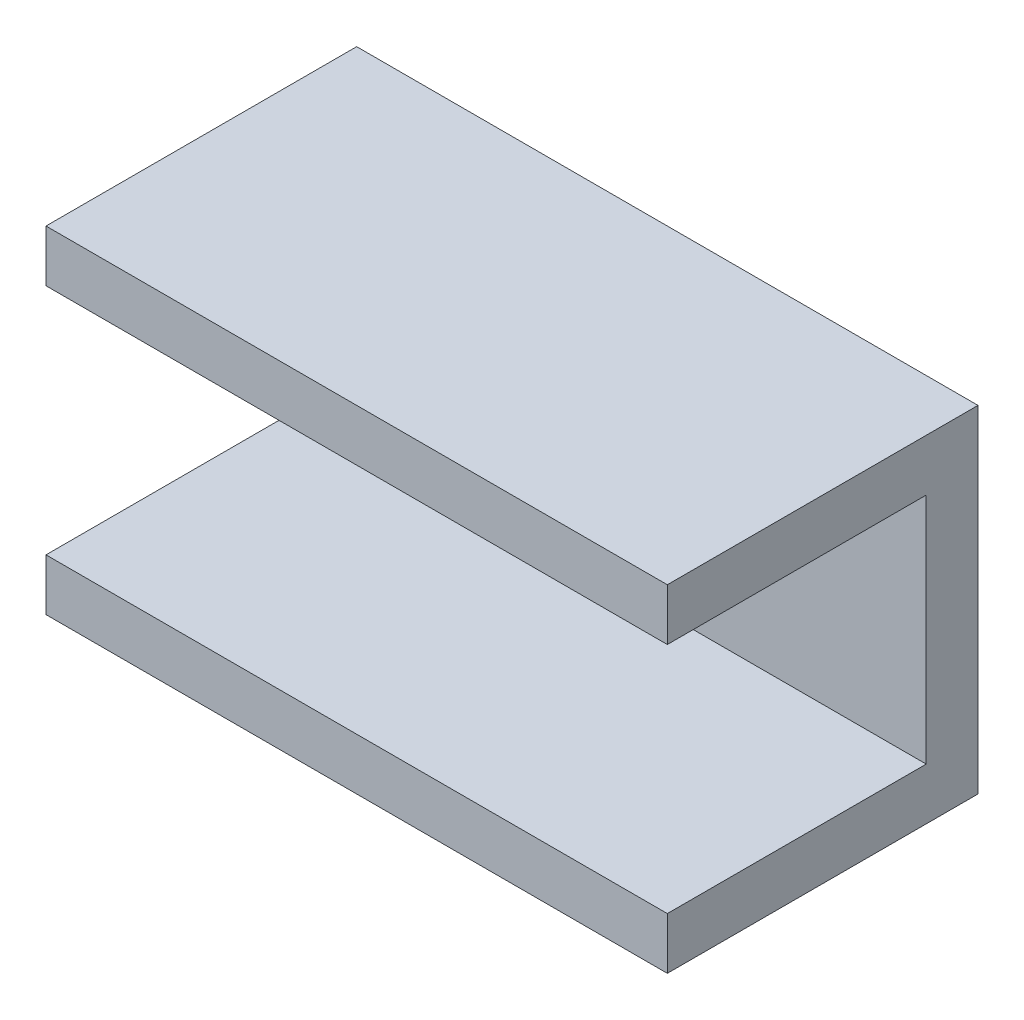
ISO-10303-21;
HEADER;
FILE_DESCRIPTION(('STEP AP214'),'2;1');
FILE_NAME('part.step','',(''),(''),'','','');
FILE_SCHEMA(('AUTOMOTIVE_DESIGN { 1 0 10303 214 1 1 1 1 }'));
ENDSEC;
DATA;
#1=APPLICATION_CONTEXT('core data for automotive mechanical design processes');
#2=APPLICATION_PROTOCOL_DEFINITION('international standard','automotive_design',2000,#1);
#3=PRODUCT_CONTEXT('',#1,'mechanical');
#4=PRODUCT('Part','Part','',(#3));
#5=PRODUCT_RELATED_PRODUCT_CATEGORY('part','',(#4));
#6=PRODUCT_DEFINITION_FORMATION('','',#4);
#7=PRODUCT_DEFINITION_CONTEXT('part definition',#1,'design');
#8=PRODUCT_DEFINITION('design','',#6,#7);
#9=PRODUCT_DEFINITION_SHAPE('','',#8);
#10=(LENGTH_UNIT() NAMED_UNIT(*) SI_UNIT(.MILLI.,.METRE.));
#11=(NAMED_UNIT(*) PLANE_ANGLE_UNIT() SI_UNIT($,.RADIAN.));
#12=(NAMED_UNIT(*) SI_UNIT($,.STERADIAN.) SOLID_ANGLE_UNIT());
#13=UNCERTAINTY_MEASURE_WITH_UNIT(LENGTH_MEASURE(1.E-05),#10,'distance_accuracy_value','');
#14=(GEOMETRIC_REPRESENTATION_CONTEXT(3) GLOBAL_UNCERTAINTY_ASSIGNED_CONTEXT((#13)) GLOBAL_UNIT_ASSIGNED_CONTEXT((#10,
#11,#12)) REPRESENTATION_CONTEXT('',''));
#15=CARTESIAN_POINT('',(0.,0.,0.));
#16=DIRECTION('',(0.,0.,1.));
#17=DIRECTION('',(1.,0.,0.));
#18=AXIS2_PLACEMENT_3D('',#15,#16,#17);
#19=CARTESIAN_POINT('',(76.2,0.,6.35));
#20=DIRECTION('',(0.,0.,-1.));
#21=DIRECTION('',(-1.,0.,0.));
#22=AXIS2_PLACEMENT_3D('',#19,#20,#21);
#23=PLANE('',#22);
#24=DIRECTION('',(0.,-1.,0.));
#25=VECTOR('',#24,1.);
#26=CARTESIAN_POINT('',(0.,0.,6.35));
#27=LINE('',#26,#25);
#28=CARTESIAN_POINT('',(0.,14.2875,6.35));
#29=VERTEX_POINT('',#28);
#30=CARTESIAN_POINT('',(0.,-14.2875,6.35));
#31=VERTEX_POINT('',#30);
#32=EDGE_CURVE('E133',#29,#31,#27,.T.);
#33=ORIENTED_EDGE('',*,*,#32,.T.);
#34=DIRECTION('',(-1.,0.,0.));
#35=VECTOR('',#34,1.);
#36=CARTESIAN_POINT('',(76.2,-14.2875,6.35));
#37=LINE('',#36,#35);
#38=CARTESIAN_POINT('',(76.2,-14.2875,6.35));
#39=VERTEX_POINT('',#38);
#40=EDGE_CURVE('E11',#39,#31,#37,.T.);
#41=ORIENTED_EDGE('',*,*,#40,.F.);
#42=DIRECTION('',(0.,-1.,0.));
#43=VECTOR('',#42,1.);
#44=CARTESIAN_POINT('',(76.2,0.,6.35));
#45=LINE('',#44,#43);
#46=CARTESIAN_POINT('',(76.2,14.2875,6.35));
#47=VERTEX_POINT('',#46);
#48=EDGE_CURVE('E94',#47,#39,#45,.T.);
#49=ORIENTED_EDGE('',*,*,#48,.F.);
#50=DIRECTION('',(-1.,0.,0.));
#51=VECTOR('',#50,1.);
#52=CARTESIAN_POINT('',(76.2,14.2875,6.35));
#53=LINE('',#52,#51);
#54=EDGE_CURVE('E129',#47,#29,#53,.T.);
#55=ORIENTED_EDGE('',*,*,#54,.T.);
#56=EDGE_LOOP('',(#33,#41,#49,#55));
#57=FACE_BOUND('',#56,.T.);
#58=ADVANCED_FACE('F38',(#57),#23,.F.);
#59=CARTESIAN_POINT('',(76.2,-14.2875,0.));
#60=DIRECTION('',(0.,1.,0.));
#61=DIRECTION('',(0.,0.,1.));
#62=AXIS2_PLACEMENT_3D('',#59,#60,#61);
#63=PLANE('',#62);
#64=DIRECTION('',(0.,0.,-1.));
#65=VECTOR('',#64,1.);
#66=CARTESIAN_POINT('',(0.,-14.2875,0.));
#67=LINE('',#66,#65);
#68=CARTESIAN_POINT('',(0.,-14.2875,38.1));
#69=VERTEX_POINT('',#68);
#70=EDGE_CURVE('E136',#69,#31,#67,.T.);
#71=ORIENTED_EDGE('',*,*,#70,.F.);
#72=DIRECTION('',(-1.,0.,0.));
#73=VECTOR('',#72,1.);
#74=CARTESIAN_POINT('',(76.2,-14.2875,38.1));
#75=LINE('',#74,#73);
#76=CARTESIAN_POINT('',(76.2,-14.2875,38.1));
#77=VERTEX_POINT('',#76);
#78=EDGE_CURVE('E46',#77,#69,#75,.T.);
#79=ORIENTED_EDGE('',*,*,#78,.F.);
#80=DIRECTION('',(0.,0.,-1.));
#81=VECTOR('',#80,1.);
#82=CARTESIAN_POINT('',(76.2,-14.2875,0.));
#83=LINE('',#82,#81);
#84=EDGE_CURVE('E176',#77,#39,#83,.T.);
#85=ORIENTED_EDGE('',*,*,#84,.T.);
#86=ORIENTED_EDGE('',*,*,#40,.T.);
#87=EDGE_LOOP('',(#71,#79,#85,#86));
#88=FACE_BOUND('',#87,.T.);
#89=ADVANCED_FACE('F166',(#88),#63,.T.);
#90=CARTESIAN_POINT('',(76.2,0.,38.1));
#91=DIRECTION('',(0.,0.,1.));
#92=DIRECTION('',(0.,-1.,0.));
#93=AXIS2_PLACEMENT_3D('',#90,#91,#92);
#94=PLANE('',#93);
#95=DIRECTION('',(0.,1.,0.));
#96=VECTOR('',#95,1.);
#97=CARTESIAN_POINT('',(0.,0.,38.1));
#98=LINE('',#97,#96);
#99=CARTESIAN_POINT('',(0.,-20.6375,38.1));
#100=VERTEX_POINT('',#99);
#101=EDGE_CURVE('E139',#100,#69,#98,.T.);
#102=ORIENTED_EDGE('',*,*,#101,.F.);
#103=DIRECTION('',(-1.,0.,0.));
#104=VECTOR('',#103,1.);
#105=CARTESIAN_POINT('',(76.2,-20.6375,38.1));
#106=LINE('',#105,#104);
#107=CARTESIAN_POINT('',(76.2,-20.6375,38.1));
#108=VERTEX_POINT('',#107);
#109=EDGE_CURVE('E156',#108,#100,#106,.T.);
#110=ORIENTED_EDGE('',*,*,#109,.F.);
#111=DIRECTION('',(0.,1.,0.));
#112=VECTOR('',#111,1.);
#113=CARTESIAN_POINT('',(76.2,0.,38.1));
#114=LINE('',#113,#112);
#115=EDGE_CURVE('E163',#108,#77,#114,.T.);
#116=ORIENTED_EDGE('',*,*,#115,.T.);
#117=ORIENTED_EDGE('',*,*,#78,.T.);
#118=EDGE_LOOP('',(#102,#110,#116,#117));
#119=FACE_BOUND('',#118,.T.);
#120=ADVANCED_FACE('F161',(#119),#94,.T.);
#121=CARTESIAN_POINT('',(76.2,-20.6375,0.));
#122=DIRECTION('',(0.,-1.,0.));
#123=DIRECTION('',(0.,0.,-1.));
#124=AXIS2_PLACEMENT_3D('',#121,#122,#123);
#125=PLANE('',#124);
#126=DIRECTION('',(0.,0.,1.));
#127=VECTOR('',#126,1.);
#128=CARTESIAN_POINT('',(0.,-20.6375,0.));
#129=LINE('',#128,#127);
#130=CARTESIAN_POINT('',(0.,-20.6375,0.));
#131=VERTEX_POINT('',#130);
#132=EDGE_CURVE('E142',#131,#100,#129,.T.);
#133=ORIENTED_EDGE('',*,*,#132,.F.);
#134=DIRECTION('',(-1.,0.,0.));
#135=VECTOR('',#134,1.);
#136=CARTESIAN_POINT('',(76.2,-20.6375,0.));
#137=LINE('',#136,#135);
#138=CARTESIAN_POINT('',(76.2,-20.6375,0.));
#139=VERTEX_POINT('',#138);
#140=EDGE_CURVE('E154',#139,#131,#137,.T.);
#141=ORIENTED_EDGE('',*,*,#140,.F.);
#142=DIRECTION('',(0.,0.,1.));
#143=VECTOR('',#142,1.);
#144=CARTESIAN_POINT('',(76.2,-20.6375,0.));
#145=LINE('',#144,#143);
#146=EDGE_CURVE('E175',#139,#108,#145,.T.);
#147=ORIENTED_EDGE('',*,*,#146,.T.);
#148=ORIENTED_EDGE('',*,*,#109,.T.);
#149=EDGE_LOOP('',(#133,#141,#147,#148));
#150=FACE_BOUND('',#149,.T.);
#151=ADVANCED_FACE('F173',(#150),#125,.T.);
#152=CARTESIAN_POINT('',(76.2,0.,0.));
#153=DIRECTION('',(0.,0.,-1.));
#154=DIRECTION('',(0.,1.,0.));
#155=AXIS2_PLACEMENT_3D('',#152,#153,#154);
#156=PLANE('',#155);
#157=DIRECTION('',(0.,-1.,0.));
#158=VECTOR('',#157,1.);
#159=CARTESIAN_POINT('',(0.,0.,0.));
#160=LINE('',#159,#158);
#161=CARTESIAN_POINT('',(0.,20.6375,0.));
#162=VERTEX_POINT('',#161);
#163=EDGE_CURVE('E145',#162,#131,#160,.T.);
#164=ORIENTED_EDGE('',*,*,#163,.F.);
#165=DIRECTION('',(-1.,0.,0.));
#166=VECTOR('',#165,1.);
#167=CARTESIAN_POINT('',(76.2,20.6375,0.));
#168=LINE('',#167,#166);
#169=CARTESIAN_POINT('',(76.2,20.6375,0.));
#170=VERTEX_POINT('',#169);
#171=EDGE_CURVE('E124',#170,#162,#168,.T.);
#172=ORIENTED_EDGE('',*,*,#171,.F.);
#173=DIRECTION('',(0.,-1.,0.));
#174=VECTOR('',#173,1.);
#175=CARTESIAN_POINT('',(76.2,0.,0.));
#176=LINE('',#175,#174);
#177=EDGE_CURVE('E117',#170,#139,#176,.T.);
#178=ORIENTED_EDGE('',*,*,#177,.T.);
#179=ORIENTED_EDGE('',*,*,#140,.T.);
#180=EDGE_LOOP('',(#164,#172,#178,#179));
#181=FACE_BOUND('',#180,.T.);
#182=ADVANCED_FACE('F182',(#181),#156,.T.);
#183=CARTESIAN_POINT('',(76.2,20.6375,0.));
#184=DIRECTION('',(0.,-1.,0.));
#185=DIRECTION('',(0.,0.,-1.));
#186=AXIS2_PLACEMENT_3D('',#183,#184,#185);
#187=PLANE('',#186);
#188=DIRECTION('',(0.,0.,1.));
#189=VECTOR('',#188,1.);
#190=CARTESIAN_POINT('',(0.,20.6375,0.));
#191=LINE('',#190,#189);
#192=CARTESIAN_POINT('',(0.,20.6375,38.1));
#193=VERTEX_POINT('',#192);
#194=EDGE_CURVE('E123',#162,#193,#191,.T.);
#195=ORIENTED_EDGE('',*,*,#194,.T.);
#196=DIRECTION('',(-1.,0.,0.));
#197=VECTOR('',#196,1.);
#198=CARTESIAN_POINT('',(76.2,20.6375,38.1));
#199=LINE('',#198,#197);
#200=CARTESIAN_POINT('',(76.2,20.6375,38.1));
#201=VERTEX_POINT('',#200);
#202=EDGE_CURVE('E120',#201,#193,#199,.T.);
#203=ORIENTED_EDGE('',*,*,#202,.F.);
#204=DIRECTION('',(0.,0.,1.));
#205=VECTOR('',#204,1.);
#206=CARTESIAN_POINT('',(76.2,20.6375,0.));
#207=LINE('',#206,#205);
#208=EDGE_CURVE('E110',#170,#201,#207,.T.);
#209=ORIENTED_EDGE('',*,*,#208,.F.);
#210=ORIENTED_EDGE('',*,*,#171,.T.);
#211=EDGE_LOOP('',(#195,#203,#209,#210));
#212=FACE_BOUND('',#211,.T.);
#213=ADVANCED_FACE('F121',(#212),#187,.F.);
#214=CARTESIAN_POINT('',(76.2,0.,38.1));
#215=DIRECTION('',(0.,0.,-1.));
#216=DIRECTION('',(0.,1.,0.));
#217=AXIS2_PLACEMENT_3D('',#214,#215,#216);
#218=PLANE('',#217);
#219=DIRECTION('',(0.,-1.,0.));
#220=VECTOR('',#219,1.);
#221=CARTESIAN_POINT('',(0.,0.,38.1));
#222=LINE('',#221,#220);
#223=CARTESIAN_POINT('',(0.,14.2875,38.1));
#224=VERTEX_POINT('',#223);
#225=EDGE_CURVE('E82',#193,#224,#222,.T.);
#226=ORIENTED_EDGE('',*,*,#225,.T.);
#227=DIRECTION('',(-1.,0.,0.));
#228=VECTOR('',#227,1.);
#229=CARTESIAN_POINT('',(76.2,14.2875,38.1));
#230=LINE('',#229,#228);
#231=CARTESIAN_POINT('',(76.2,14.2875,38.1));
#232=VERTEX_POINT('',#231);
#233=EDGE_CURVE('E125',#232,#224,#230,.T.);
#234=ORIENTED_EDGE('',*,*,#233,.F.);
#235=DIRECTION('',(0.,-1.,0.));
#236=VECTOR('',#235,1.);
#237=CARTESIAN_POINT('',(76.2,0.,38.1));
#238=LINE('',#237,#236);
#239=EDGE_CURVE('E114',#201,#232,#238,.T.);
#240=ORIENTED_EDGE('',*,*,#239,.F.);
#241=ORIENTED_EDGE('',*,*,#202,.T.);
#242=EDGE_LOOP('',(#226,#234,#240,#241));
#243=FACE_BOUND('',#242,.T.);
#244=ADVANCED_FACE('F127',(#243),#218,.F.);
#245=CARTESIAN_POINT('',(76.2,14.2875,0.));
#246=DIRECTION('',(0.,1.,0.));
#247=DIRECTION('',(0.,0.,1.));
#248=AXIS2_PLACEMENT_3D('',#245,#246,#247);
#249=PLANE('',#248);
#250=DIRECTION('',(0.,0.,-1.));
#251=VECTOR('',#250,1.);
#252=CARTESIAN_POINT('',(0.,14.2875,0.));
#253=LINE('',#252,#251);
#254=EDGE_CURVE('E88',#224,#29,#253,.T.);
#255=ORIENTED_EDGE('',*,*,#254,.T.);
#256=ORIENTED_EDGE('',*,*,#54,.F.);
#257=DIRECTION('',(0.,0.,-1.));
#258=VECTOR('',#257,1.);
#259=CARTESIAN_POINT('',(76.2,14.2875,0.));
#260=LINE('',#259,#258);
#261=EDGE_CURVE('E54',#232,#47,#260,.T.);
#262=ORIENTED_EDGE('',*,*,#261,.F.);
#263=ORIENTED_EDGE('',*,*,#233,.T.);
#264=EDGE_LOOP('',(#255,#256,#262,#263));
#265=FACE_BOUND('',#264,.T.);
#266=ADVANCED_FACE('F184',(#265),#249,.F.);
#267=CARTESIAN_POINT('',(76.2,0.,0.));
#268=DIRECTION('',(1.,0.,0.));
#269=DIRECTION('',(0.,0.,-1.));
#270=AXIS2_PLACEMENT_3D('',#267,#268,#269);
#271=PLANE('',#270);
#272=ORIENTED_EDGE('',*,*,#48,.T.);
#273=ORIENTED_EDGE('',*,*,#84,.F.);
#274=ORIENTED_EDGE('',*,*,#115,.F.);
#275=ORIENTED_EDGE('',*,*,#146,.F.);
#276=ORIENTED_EDGE('',*,*,#177,.F.);
#277=ORIENTED_EDGE('',*,*,#208,.T.);
#278=ORIENTED_EDGE('',*,*,#239,.T.);
#279=ORIENTED_EDGE('',*,*,#261,.T.);
#280=EDGE_LOOP('',(#272,#273,#274,#275,#276,#277,#278,#279));
#281=FACE_BOUND('',#280,.T.);
#282=ADVANCED_FACE('F112',(#281),#271,.T.);
#283=CARTESIAN_POINT('',(0.,0.,0.));
#284=DIRECTION('',(1.,0.,0.));
#285=DIRECTION('',(0.,0.,-1.));
#286=AXIS2_PLACEMENT_3D('',#283,#284,#285);
#287=PLANE('',#286);
#288=ORIENTED_EDGE('',*,*,#32,.F.);
#289=ORIENTED_EDGE('',*,*,#254,.F.);
#290=ORIENTED_EDGE('',*,*,#225,.F.);
#291=ORIENTED_EDGE('',*,*,#194,.F.);
#292=ORIENTED_EDGE('',*,*,#163,.T.);
#293=ORIENTED_EDGE('',*,*,#132,.T.);
#294=ORIENTED_EDGE('',*,*,#101,.T.);
#295=ORIENTED_EDGE('',*,*,#70,.T.);
#296=EDGE_LOOP('',(#288,#289,#290,#291,#292,#293,#294,#295));
#297=FACE_BOUND('',#296,.T.);
#298=ADVANCED_FACE('F169',(#297),#287,.F.);
#299=CLOSED_SHELL('',(#58,#89,#120,#151,#182,#213,#244,#266,#282,#298));
#300=MANIFOLD_SOLID_BREP('B2',#299);
#301=ADVANCED_BREP_SHAPE_REPRESENTATION('',(#18,#300),#14);
#302=SHAPE_DEFINITION_REPRESENTATION(#9,#301);
ENDSEC;
END-ISO-10303-21;
